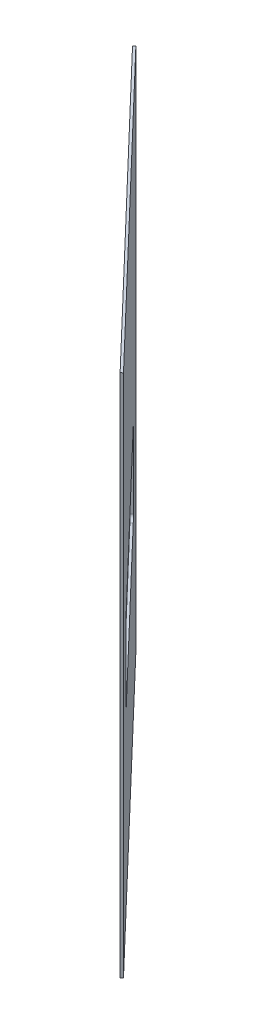
ISO-10303-21;
HEADER;
FILE_DESCRIPTION(('STEP AP214'),'2;1');
FILE_NAME('part.step','',(''),(''),'','','');
FILE_SCHEMA(('AUTOMOTIVE_DESIGN { 1 0 10303 214 1 1 1 1 }'));
ENDSEC;
DATA;
#1=APPLICATION_CONTEXT('core data for automotive mechanical design processes');
#2=APPLICATION_PROTOCOL_DEFINITION('international standard','automotive_design',2000,#1);
#3=PRODUCT_CONTEXT('',#1,'mechanical');
#4=PRODUCT('Part','Part','',(#3));
#5=PRODUCT_RELATED_PRODUCT_CATEGORY('part','',(#4));
#6=PRODUCT_DEFINITION_FORMATION('','',#4);
#7=PRODUCT_DEFINITION_CONTEXT('part definition',#1,'design');
#8=PRODUCT_DEFINITION('design','',#6,#7);
#9=PRODUCT_DEFINITION_SHAPE('','',#8);
#10=(LENGTH_UNIT() NAMED_UNIT(*) SI_UNIT(.MILLI.,.METRE.));
#11=(NAMED_UNIT(*) PLANE_ANGLE_UNIT() SI_UNIT($,.RADIAN.));
#12=(NAMED_UNIT(*) SI_UNIT($,.STERADIAN.) SOLID_ANGLE_UNIT());
#13=UNCERTAINTY_MEASURE_WITH_UNIT(LENGTH_MEASURE(1.E-05),#10,'distance_accuracy_value','');
#14=(GEOMETRIC_REPRESENTATION_CONTEXT(3) GLOBAL_UNCERTAINTY_ASSIGNED_CONTEXT((#13)) GLOBAL_UNIT_ASSIGNED_CONTEXT((#10,
#11,#12)) REPRESENTATION_CONTEXT('',''));
#15=CARTESIAN_POINT('',(0.,0.,0.));
#16=DIRECTION('',(0.,0.,1.));
#17=DIRECTION('',(1.,0.,0.));
#18=AXIS2_PLACEMENT_3D('',#15,#16,#17);
#19=CARTESIAN_POINT('',(5927.88281303436,704.85,-7815.76104086973));
#20=DIRECTION('',(-0.722423381207088,0.,0.691450980392188));
#21=DIRECTION('',(0.,1.,0.));
#22=AXIS2_PLACEMENT_3D('',#19,#20,#21);
#23=PLANE('',#22);
#24=DIRECTION('',(-0.691450980392188,0.,-0.722423381207088));
#25=VECTOR('',#24,1.);
#26=CARTESIAN_POINT('',(5926.72986335179,685.8,-7816.96563502269));
#27=LINE('',#26,#25);
#28=CARTESIAN_POINT('',(6138.6370718579,685.8,-7595.56639427781));
#29=VERTEX_POINT('',#28);
#30=CARTESIAN_POINT('',(5717.12855421082,685.8,-8035.95568746165));
#31=VERTEX_POINT('',#30);
#32=EDGE_CURVE('E201',#29,#31,#27,.T.);
#33=ORIENTED_EDGE('',*,*,#32,.T.);
#34=CARTESIAN_POINT('',(5717.12855421082,673.1,-8035.95568746165));
#35=DIRECTION('',(-0.722423381207088,0.,0.691450980392188));
#36=DIRECTION('',(0.,1.,0.));
#37=AXIS2_PLACEMENT_3D('',#34,#35,#36);
#38=CIRCLE('',#37,12.7);
#39=CARTESIAN_POINT('',(5708.34712675984,673.1,-8045.13046440298));
#40=VERTEX_POINT('',#39);
#41=EDGE_CURVE('E102',#31,#40,#38,.T.);
#42=ORIENTED_EDGE('',*,*,#41,.T.);
#43=DIRECTION('',(0.,-1.,0.));
#44=VECTOR('',#43,1.);
#45=CARTESIAN_POINT('',(5708.34712675984,582.272617626172,-8045.13046440298));
#46=LINE('',#45,#44);
#47=CARTESIAN_POINT('',(5708.34712675984,476.25,-8045.13046440298));
#48=VERTEX_POINT('',#47);
#49=EDGE_CURVE('E98',#48,#40,#46,.F.);
#50=ORIENTED_EDGE('',*,*,#49,.F.);
#51=CARTESIAN_POINT('',(5717.12855421082,476.25,-8035.95568746165));
#52=DIRECTION('',(-0.722423381207088,0.,0.691450980392188));
#53=DIRECTION('',(0.,1.,0.));
#54=AXIS2_PLACEMENT_3D('',#51,#52,#53);
#55=CIRCLE('',#54,12.7);
#56=CARTESIAN_POINT('',(5717.12855421082,463.55,-8035.95568746165));
#57=VERTEX_POINT('',#56);
#58=EDGE_CURVE('E195',#48,#57,#55,.T.);
#59=ORIENTED_EDGE('',*,*,#58,.T.);
#60=DIRECTION('',(-0.691450980392188,0.,-0.722423381207088));
#61=VECTOR('',#60,1.);
#62=CARTESIAN_POINT('',(5926.72986335179,463.55,-7816.96563502269));
#63=LINE('',#62,#61);
#64=CARTESIAN_POINT('',(6138.6370718579,463.55,-7595.56639427781));
#65=VERTEX_POINT('',#64);
#66=EDGE_CURVE('E175',#65,#57,#63,.T.);
#67=ORIENTED_EDGE('',*,*,#66,.F.);
#68=CARTESIAN_POINT('',(6138.6370718579,476.25,-7595.56639427781));
#69=DIRECTION('',(-0.722423381207088,0.,0.691450980392188));
#70=DIRECTION('',(0.,1.,0.));
#71=AXIS2_PLACEMENT_3D('',#68,#69,#70);
#72=CIRCLE('',#71,12.7);
#73=CARTESIAN_POINT('',(6147.41849930888,476.25,-7586.39161733648));
#74=VERTEX_POINT('',#73);
#75=EDGE_CURVE('E193',#65,#74,#72,.T.);
#76=ORIENTED_EDGE('',*,*,#75,.T.);
#77=DIRECTION('',(0.,-1.,0.));
#78=VECTOR('',#77,1.);
#79=CARTESIAN_POINT('',(6147.41849930888,582.272617626172,-7586.39161733648));
#80=LINE('',#79,#78);
#81=CARTESIAN_POINT('',(6147.41849930888,673.1,-7586.39161733648));
#82=VERTEX_POINT('',#81);
#83=EDGE_CURVE('E191',#74,#82,#80,.F.);
#84=ORIENTED_EDGE('',*,*,#83,.T.);
#85=CARTESIAN_POINT('',(6138.6370718579,673.1,-7595.56639427781));
#86=DIRECTION('',(-0.722423381207088,0.,0.691450980392188));
#87=DIRECTION('',(0.,1.,0.));
#88=AXIS2_PLACEMENT_3D('',#85,#86,#87);
#89=CIRCLE('',#88,12.7);
#90=EDGE_CURVE('E189',#82,#29,#89,.T.);
#91=ORIENTED_EDGE('',*,*,#90,.T.);
#92=EDGE_LOOP('',(#33,#42,#50,#59,#67,#76,#84,#91));
#93=FACE_BOUND('',#92,.T.);
#94=DIRECTION('',(-0.691450980392188,0.,-0.722423381207088));
#95=VECTOR('',#94,1.);
#96=CARTESIAN_POINT('',(5942.26713271405,6.35,-7800.73239942725));
#97=LINE('',#96,#95);
#98=CARTESIAN_POINT('',(6296.70276597555,6.35,-7430.42040933387));
#99=VERTEX_POINT('',#98);
#100=CARTESIAN_POINT('',(5559.06286009316,6.35,-8201.10167240559));
#101=VERTEX_POINT('',#100);
#102=EDGE_CURVE('E187',#99,#101,#97,.T.);
#103=ORIENTED_EDGE('',*,*,#102,.T.);
#104=DIRECTION('',(0.,-1.,0.));
#105=VECTOR('',#104,1.);
#106=CARTESIAN_POINT('',(5559.06286009316,423.83526692391,-8201.10167240559));
#107=LINE('',#106,#105);
#108=CARTESIAN_POINT('',(5559.06286009316,1403.35,-8201.10167240559));
#109=VERTEX_POINT('',#108);
#110=EDGE_CURVE('E131',#101,#109,#107,.F.);
#111=ORIENTED_EDGE('',*,*,#110,.T.);
#112=DIRECTION('',(-0.691450980392188,0.,-0.722423381207088));
#113=VECTOR('',#112,1.);
#114=CARTESIAN_POINT('',(5885.38614020328,1403.35,-7860.16128173607));
#115=LINE('',#114,#113);
#116=CARTESIAN_POINT('',(6296.70276597555,1403.35,-7430.42040933387));
#117=VERTEX_POINT('',#116);
#118=EDGE_CURVE('E183',#117,#109,#115,.T.);
#119=ORIENTED_EDGE('',*,*,#118,.F.);
#120=DIRECTION('',(0.,-1.,0.));
#121=VECTOR('',#120,1.);
#122=CARTESIAN_POINT('',(6296.70276597555,423.83526692391,-7430.42040933387));
#123=LINE('',#122,#121);
#124=EDGE_CURVE('E180',#99,#117,#123,.F.);
#125=ORIENTED_EDGE('',*,*,#124,.F.);
#126=EDGE_LOOP('',(#103,#111,#119,#125));
#127=FACE_BOUND('',#126,.T.);
#128=ADVANCED_FACE('F33',(#93,#127),#23,.F.);
#129=CARTESIAN_POINT('',(6828.89971792966,1403.35,-9416.49691448939));
#130=DIRECTION('',(-0.691450980392188,0.,-0.722423381207088));
#131=DIRECTION('',(-0.722423381207088,0.,0.691450980392188));
#132=AXIS2_PLACEMENT_3D('',#129,#130,#131);
#133=PLANE('',#132);
#134=ORIENTED_EDGE('',*,*,#110,.F.);
#135=DIRECTION('',(-0.722423381207088,0.,0.691450980392188));
#136=VECTOR('',#135,1.);
#137=CARTESIAN_POINT('',(6828.89971792966,6.35,-9416.49691448939));
#138=LINE('',#137,#136);
#139=CARTESIAN_POINT('',(5554.4754716225,6.35,-8196.7109586801));
#140=VERTEX_POINT('',#139);
#141=EDGE_CURVE('E124',#101,#140,#138,.T.);
#142=ORIENTED_EDGE('',*,*,#141,.T.);
#143=DIRECTION('',(0.,-1.,0.));
#144=VECTOR('',#143,1.);
#145=CARTESIAN_POINT('',(5554.4754716225,1403.35,-8196.7109586801));
#146=LINE('',#145,#144);
#147=CARTESIAN_POINT('',(5554.4754716225,1403.35,-8196.7109586801));
#148=VERTEX_POINT('',#147);
#149=EDGE_CURVE('E128',#148,#140,#146,.T.);
#150=ORIENTED_EDGE('',*,*,#149,.F.);
#151=DIRECTION('',(-0.722423381207088,0.,0.691450980392188));
#152=VECTOR('',#151,1.);
#153=CARTESIAN_POINT('',(6828.89971792966,1403.35,-9416.49691448939));
#154=LINE('',#153,#152);
#155=EDGE_CURVE('E149',#109,#148,#154,.T.);
#156=ORIENTED_EDGE('',*,*,#155,.F.);
#157=EDGE_LOOP('',(#134,#142,#150,#156));
#158=FACE_BOUND('',#157,.T.);
#159=ADVANCED_FACE('F126',(#158),#133,.T.);
#160=CARTESIAN_POINT('',(6828.89971792966,6.35,-9416.49691448939));
#161=DIRECTION('',(0.,-1.,0.));
#162=DIRECTION('',(0.,0.,-1.));
#163=AXIS2_PLACEMENT_3D('',#160,#161,#162);
#164=PLANE('',#163);
#165=ORIENTED_EDGE('',*,*,#102,.F.);
#166=DIRECTION('',(-0.722423381207088,0.,0.691450980392188));
#167=VECTOR('',#166,1.);
#168=CARTESIAN_POINT('',(7566.53962381205,6.35,-8645.81565141766));
#169=LINE('',#168,#167);
#170=CARTESIAN_POINT('',(6292.11537750489,6.35,-7426.02969560838));
#171=VERTEX_POINT('',#170);
#172=EDGE_CURVE('E134',#99,#171,#169,.T.);
#173=ORIENTED_EDGE('',*,*,#172,.T.);
#174=DIRECTION('',(0.691450980392188,0.,0.722423381207088));
#175=VECTOR('',#174,1.);
#176=CARTESIAN_POINT('',(5554.4754716225,6.35,-8196.7109586801));
#177=LINE('',#176,#175);
#178=EDGE_CURVE('E137',#140,#171,#177,.T.);
#179=ORIENTED_EDGE('',*,*,#178,.F.);
#180=ORIENTED_EDGE('',*,*,#141,.F.);
#181=EDGE_LOOP('',(#165,#173,#179,#180));
#182=FACE_BOUND('',#181,.T.);
#183=ADVANCED_FACE('F138',(#182),#164,.T.);
#184=CARTESIAN_POINT('',(7566.53962381205,6.35,-8645.81565141766));
#185=DIRECTION('',(0.691450980392188,0.,0.722423381207088));
#186=DIRECTION('',(0.722423381207088,0.,-0.691450980392188));
#187=AXIS2_PLACEMENT_3D('',#184,#185,#186);
#188=PLANE('',#187);
#189=ORIENTED_EDGE('',*,*,#124,.T.);
#190=DIRECTION('',(-0.722423381207088,0.,0.691450980392188));
#191=VECTOR('',#190,1.);
#192=CARTESIAN_POINT('',(7566.53962381205,1403.35,-8645.81565141766));
#193=LINE('',#192,#191);
#194=CARTESIAN_POINT('',(6292.11537750489,1403.35,-7426.02969560838));
#195=VERTEX_POINT('',#194);
#196=EDGE_CURVE('E182',#117,#195,#193,.T.);
#197=ORIENTED_EDGE('',*,*,#196,.T.);
#198=DIRECTION('',(0.,1.,0.));
#199=VECTOR('',#198,1.);
#200=CARTESIAN_POINT('',(6292.11537750489,6.35,-7426.02969560838));
#201=LINE('',#200,#199);
#202=EDGE_CURVE('E143',#171,#195,#201,.T.);
#203=ORIENTED_EDGE('',*,*,#202,.F.);
#204=ORIENTED_EDGE('',*,*,#172,.F.);
#205=EDGE_LOOP('',(#189,#197,#203,#204));
#206=FACE_BOUND('',#205,.T.);
#207=ADVANCED_FACE('F262',(#206),#188,.T.);
#208=CARTESIAN_POINT('',(7566.53962381205,1403.35,-8645.81565141766));
#209=DIRECTION('',(0.,1.,0.));
#210=DIRECTION('',(0.,0.,1.));
#211=AXIS2_PLACEMENT_3D('',#208,#209,#210);
#212=PLANE('',#211);
#213=ORIENTED_EDGE('',*,*,#118,.T.);
#214=ORIENTED_EDGE('',*,*,#155,.T.);
#215=DIRECTION('',(-0.691450980392188,0.,-0.722423381207088));
#216=VECTOR('',#215,1.);
#217=CARTESIAN_POINT('',(6292.11537750489,1403.35,-7426.02969560838));
#218=LINE('',#217,#216);
#219=EDGE_CURVE('E147',#195,#148,#218,.T.);
#220=ORIENTED_EDGE('',*,*,#219,.F.);
#221=ORIENTED_EDGE('',*,*,#196,.F.);
#222=EDGE_LOOP('',(#213,#214,#220,#221));
#223=FACE_BOUND('',#222,.T.);
#224=ADVANCED_FACE('F267',(#223),#212,.T.);
#225=CARTESIAN_POINT('',(6993.2799547048,0.,-6693.45761312165));
#226=DIRECTION('',(-0.722423381207088,0.,0.691450980392188));
#227=DIRECTION('',(0.691450980392188,0.,0.722423381207088));
#228=AXIS2_PLACEMENT_3D('',#225,#226,#227);
#229=PLANE('',#228);
#230=CARTESIAN_POINT('',(5712.54116574015,673.1,-8031.56497373616));
#231=DIRECTION('',(-0.722423381207088,0.,0.691450980392188));
#232=DIRECTION('',(0.691450980392188,0.,0.722423381207088));
#233=AXIS2_PLACEMENT_3D('',#230,#231,#232);
#234=CIRCLE('',#233,12.7000000000001);
#235=CARTESIAN_POINT('',(5712.54116574015,685.8,-8031.56497373616));
#236=VERTEX_POINT('',#235);
#237=CARTESIAN_POINT('',(5703.75973828917,673.1,-8040.73975067749));
#238=VERTEX_POINT('',#237);
#239=EDGE_CURVE('E11',#236,#238,#234,.T.);
#240=ORIENTED_EDGE('',*,*,#239,.F.);
#241=DIRECTION('',(-0.691450980392188,0.,-0.722423381207088));
#242=VECTOR('',#241,1.);
#243=CARTESIAN_POINT('',(6134.04968338723,685.8,-7591.17568055232));
#244=LINE('',#243,#242);
#245=CARTESIAN_POINT('',(6134.04968338723,685.8,-7591.17568055232));
#246=VERTEX_POINT('',#245);
#247=EDGE_CURVE('E153',#246,#236,#244,.T.);
#248=ORIENTED_EDGE('',*,*,#247,.F.);
#249=CARTESIAN_POINT('',(6134.04968338723,673.1,-7591.17568055232));
#250=DIRECTION('',(-0.722423381207088,0.,0.691450980392188));
#251=DIRECTION('',(0.691450980392188,0.,0.722423381207088));
#252=AXIS2_PLACEMENT_3D('',#249,#250,#251);
#253=CIRCLE('',#252,12.7000000000001);
#254=CARTESIAN_POINT('',(6142.83111083821,673.1,-7582.00090361099));
#255=VERTEX_POINT('',#254);
#256=EDGE_CURVE('E156',#255,#246,#253,.T.);
#257=ORIENTED_EDGE('',*,*,#256,.F.);
#258=DIRECTION('',(0.,1.,0.));
#259=VECTOR('',#258,1.);
#260=CARTESIAN_POINT('',(6142.83111083821,476.25,-7582.00090361099));
#261=LINE('',#260,#259);
#262=CARTESIAN_POINT('',(6142.83111083821,476.25,-7582.00090361099));
#263=VERTEX_POINT('',#262);
#264=EDGE_CURVE('E160',#263,#255,#261,.T.);
#265=ORIENTED_EDGE('',*,*,#264,.F.);
#266=CARTESIAN_POINT('',(6134.04968338723,476.25,-7591.17568055232));
#267=DIRECTION('',(-0.722423381207088,0.,0.691450980392188));
#268=DIRECTION('',(0.691450980392188,0.,0.722423381207088));
#269=AXIS2_PLACEMENT_3D('',#266,#267,#268);
#270=CIRCLE('',#269,12.7);
#271=CARTESIAN_POINT('',(6134.04968338723,463.55,-7591.17568055232));
#272=VERTEX_POINT('',#271);
#273=EDGE_CURVE('E164',#272,#263,#270,.T.);
#274=ORIENTED_EDGE('',*,*,#273,.F.);
#275=DIRECTION('',(0.691450980392188,0.,0.722423381207088));
#276=VECTOR('',#275,1.);
#277=CARTESIAN_POINT('',(5712.54116574015,463.55,-8031.56497373616));
#278=LINE('',#277,#276);
#279=CARTESIAN_POINT('',(5712.54116574015,463.55,-8031.56497373616));
#280=VERTEX_POINT('',#279);
#281=EDGE_CURVE('E168',#280,#272,#278,.T.);
#282=ORIENTED_EDGE('',*,*,#281,.F.);
#283=CARTESIAN_POINT('',(5712.54116574015,476.25,-8031.56497373616));
#284=DIRECTION('',(-0.722423381207088,0.,0.691450980392188));
#285=DIRECTION('',(0.691450980392188,0.,0.722423381207088));
#286=AXIS2_PLACEMENT_3D('',#283,#284,#285);
#287=CIRCLE('',#286,12.7000000000001);
#288=CARTESIAN_POINT('',(5703.75973828917,476.25,-8040.73975067749));
#289=VERTEX_POINT('',#288);
#290=EDGE_CURVE('E172',#289,#280,#287,.T.);
#291=ORIENTED_EDGE('',*,*,#290,.F.);
#292=DIRECTION('',(0.,-1.,0.));
#293=VECTOR('',#292,1.);
#294=CARTESIAN_POINT('',(5703.75973828917,673.1,-8040.73975067749));
#295=LINE('',#294,#293);
#296=EDGE_CURVE('E177',#238,#289,#295,.T.);
#297=ORIENTED_EDGE('',*,*,#296,.F.);
#298=EDGE_LOOP('',(#240,#248,#257,#265,#274,#282,#291,#297));
#299=FACE_BOUND('',#298,.T.);
#300=ORIENTED_EDGE('',*,*,#219,.T.);
#301=ORIENTED_EDGE('',*,*,#149,.T.);
#302=ORIENTED_EDGE('',*,*,#178,.T.);
#303=ORIENTED_EDGE('',*,*,#202,.T.);
#304=EDGE_LOOP('',(#300,#301,#302,#303));
#305=FACE_BOUND('',#304,.T.);
#306=ADVANCED_FACE('F145',(#299,#305),#229,.T.);
#307=CARTESIAN_POINT('',(6978.18398459634,673.1,-9260.52570648678));
#308=DIRECTION('',(-0.691450980392188,0.,-0.722423381207088));
#309=DIRECTION('',(-0.722423381207088,0.,0.691450980392188));
#310=AXIS2_PLACEMENT_3D('',#307,#308,#309);
#311=PLANE('',#310);
#312=DIRECTION('',(-0.722423381207088,0.,0.691450980392188));
#313=VECTOR('',#312,1.);
#314=CARTESIAN_POINT('',(6978.18398459634,476.25,-9260.52570648678));
#315=LINE('',#314,#313);
#316=EDGE_CURVE('E176',#48,#289,#315,.T.);
#317=ORIENTED_EDGE('',*,*,#316,.F.);
#318=ORIENTED_EDGE('',*,*,#49,.T.);
#319=DIRECTION('',(-0.722423381207088,0.,0.691450980392188));
#320=VECTOR('',#319,1.);
#321=CARTESIAN_POINT('',(6978.18398459634,673.1,-9260.52570648678));
#322=LINE('',#321,#320);
#323=EDGE_CURVE('E36',#40,#238,#322,.T.);
#324=ORIENTED_EDGE('',*,*,#323,.T.);
#325=ORIENTED_EDGE('',*,*,#296,.T.);
#326=EDGE_LOOP('',(#317,#318,#324,#325));
#327=FACE_BOUND('',#326,.T.);
#328=ADVANCED_FACE('F220',(#327),#311,.F.);
#329=CARTESIAN_POINT('',(6986.96541204732,476.25,-9251.35092954545));
#330=DIRECTION('',(-0.722423381207088,0.,0.691450980392188));
#331=DIRECTION('',(0.691450980392188,0.,0.722423381207088));
#332=AXIS2_PLACEMENT_3D('',#329,#330,#331);
#333=CYLINDRICAL_SURFACE('',#332,12.7000000000001);
#334=DIRECTION('',(-0.722423381207088,0.,0.691450980392188));
#335=VECTOR('',#334,1.);
#336=CARTESIAN_POINT('',(6986.96541204732,463.55,-9251.35092954545));
#337=LINE('',#336,#335);
#338=EDGE_CURVE('E171',#57,#280,#337,.T.);
#339=ORIENTED_EDGE('',*,*,#338,.F.);
#340=ORIENTED_EDGE('',*,*,#58,.F.);
#341=ORIENTED_EDGE('',*,*,#316,.T.);
#342=ORIENTED_EDGE('',*,*,#290,.T.);
#343=EDGE_LOOP('',(#339,#340,#341,#342));
#344=FACE_BOUND('',#343,.T.);
#345=ADVANCED_FACE('F215',(#344),#333,.F.);
#346=CARTESIAN_POINT('',(6986.96541204732,463.55,-9251.35092954545));
#347=DIRECTION('',(0.,-1.,0.));
#348=DIRECTION('',(0.,0.,-1.));
#349=AXIS2_PLACEMENT_3D('',#346,#347,#348);
#350=PLANE('',#349);
#351=DIRECTION('',(-0.722423381207088,0.,0.691450980392188));
#352=VECTOR('',#351,1.);
#353=CARTESIAN_POINT('',(7408.4739296944,463.55,-8810.9616363616));
#354=LINE('',#353,#352);
#355=EDGE_CURVE('E167',#65,#272,#354,.T.);
#356=ORIENTED_EDGE('',*,*,#355,.F.);
#357=ORIENTED_EDGE('',*,*,#66,.T.);
#358=ORIENTED_EDGE('',*,*,#338,.T.);
#359=ORIENTED_EDGE('',*,*,#281,.T.);
#360=EDGE_LOOP('',(#356,#357,#358,#359));
#361=FACE_BOUND('',#360,.T.);
#362=ADVANCED_FACE('F227',(#361),#350,.F.);
#363=CARTESIAN_POINT('',(7408.4739296944,476.25,-8810.9616363616));
#364=DIRECTION('',(-0.722423381207088,0.,0.691450980392188));
#365=DIRECTION('',(0.691450980392188,0.,0.722423381207088));
#366=AXIS2_PLACEMENT_3D('',#363,#364,#365);
#367=CYLINDRICAL_SURFACE('',#366,12.7);
#368=DIRECTION('',(-0.722423381207088,0.,0.691450980392188));
#369=VECTOR('',#368,1.);
#370=CARTESIAN_POINT('',(7417.25535714538,476.25,-8801.78685942028));
#371=LINE('',#370,#369);
#372=EDGE_CURVE('E163',#74,#263,#371,.T.);
#373=ORIENTED_EDGE('',*,*,#372,.F.);
#374=ORIENTED_EDGE('',*,*,#75,.F.);
#375=ORIENTED_EDGE('',*,*,#355,.T.);
#376=ORIENTED_EDGE('',*,*,#273,.T.);
#377=EDGE_LOOP('',(#373,#374,#375,#376));
#378=FACE_BOUND('',#377,.T.);
#379=ADVANCED_FACE('F234',(#378),#367,.F.);
#380=CARTESIAN_POINT('',(7417.25535714538,476.25,-8801.78685942028));
#381=DIRECTION('',(0.691450980392188,0.,0.722423381207088));
#382=DIRECTION('',(0.722423381207088,0.,-0.691450980392188));
#383=AXIS2_PLACEMENT_3D('',#380,#381,#382);
#384=PLANE('',#383);
#385=DIRECTION('',(-0.722423381207088,0.,0.691450980392188));
#386=VECTOR('',#385,1.);
#387=CARTESIAN_POINT('',(7417.25535714538,673.1,-8801.78685942028));
#388=LINE('',#387,#386);
#389=EDGE_CURVE('E159',#82,#255,#388,.T.);
#390=ORIENTED_EDGE('',*,*,#389,.F.);
#391=ORIENTED_EDGE('',*,*,#83,.F.);
#392=ORIENTED_EDGE('',*,*,#372,.T.);
#393=ORIENTED_EDGE('',*,*,#264,.T.);
#394=EDGE_LOOP('',(#390,#391,#392,#393));
#395=FACE_BOUND('',#394,.T.);
#396=ADVANCED_FACE('F236',(#395),#384,.F.);
#397=CARTESIAN_POINT('',(7408.4739296944,673.1,-8810.9616363616));
#398=DIRECTION('',(-0.722423381207088,0.,0.691450980392188));
#399=DIRECTION('',(0.691450980392188,0.,0.722423381207088));
#400=AXIS2_PLACEMENT_3D('',#397,#398,#399);
#401=CYLINDRICAL_SURFACE('',#400,12.7000000000001);
#402=DIRECTION('',(-0.722423381207088,0.,0.691450980392188));
#403=VECTOR('',#402,1.);
#404=CARTESIAN_POINT('',(7408.4739296944,685.8,-8810.9616363616));
#405=LINE('',#404,#403);
#406=EDGE_CURVE('E155',#29,#246,#405,.T.);
#407=ORIENTED_EDGE('',*,*,#406,.F.);
#408=ORIENTED_EDGE('',*,*,#90,.F.);
#409=ORIENTED_EDGE('',*,*,#389,.T.);
#410=ORIENTED_EDGE('',*,*,#256,.T.);
#411=EDGE_LOOP('',(#407,#408,#409,#410));
#412=FACE_BOUND('',#411,.T.);
#413=ADVANCED_FACE('F241',(#412),#401,.F.);
#414=CARTESIAN_POINT('',(7408.4739296944,685.8,-8810.9616363616));
#415=DIRECTION('',(0.,1.,0.));
#416=DIRECTION('',(0.,0.,1.));
#417=AXIS2_PLACEMENT_3D('',#414,#415,#416);
#418=PLANE('',#417);
#419=DIRECTION('',(-0.722423381207088,0.,0.691450980392188));
#420=VECTOR('',#419,1.);
#421=CARTESIAN_POINT('',(6986.96541204732,685.8,-9251.35092954545));
#422=LINE('',#421,#420);
#423=EDGE_CURVE('E42',#31,#236,#422,.T.);
#424=ORIENTED_EDGE('',*,*,#423,.F.);
#425=ORIENTED_EDGE('',*,*,#32,.F.);
#426=ORIENTED_EDGE('',*,*,#406,.T.);
#427=ORIENTED_EDGE('',*,*,#247,.T.);
#428=EDGE_LOOP('',(#424,#425,#426,#427));
#429=FACE_BOUND('',#428,.T.);
#430=ADVANCED_FACE('F244',(#429),#418,.F.);
#431=CARTESIAN_POINT('',(6986.96541204732,673.1,-9251.35092954545));
#432=DIRECTION('',(-0.722423381207088,0.,0.691450980392188));
#433=DIRECTION('',(0.691450980392188,0.,0.722423381207088));
#434=AXIS2_PLACEMENT_3D('',#431,#432,#433);
#435=CYLINDRICAL_SURFACE('',#434,12.7000000000001);
#436=ORIENTED_EDGE('',*,*,#323,.F.);
#437=ORIENTED_EDGE('',*,*,#41,.F.);
#438=ORIENTED_EDGE('',*,*,#423,.T.);
#439=ORIENTED_EDGE('',*,*,#239,.T.);
#440=EDGE_LOOP('',(#436,#437,#438,#439));
#441=FACE_BOUND('',#440,.T.);
#442=ADVANCED_FACE('F246',(#441),#435,.F.);
#443=CLOSED_SHELL('',(#128,#159,#183,#207,#224,#306,#328,#345,#362,#379,#396,#413,#430,#442));
#444=MANIFOLD_SOLID_BREP('B2',#443);
#445=ADVANCED_BREP_SHAPE_REPRESENTATION('',(#18,#444),#14);
#446=SHAPE_DEFINITION_REPRESENTATION(#9,#445);
ENDSEC;
END-ISO-10303-21;
